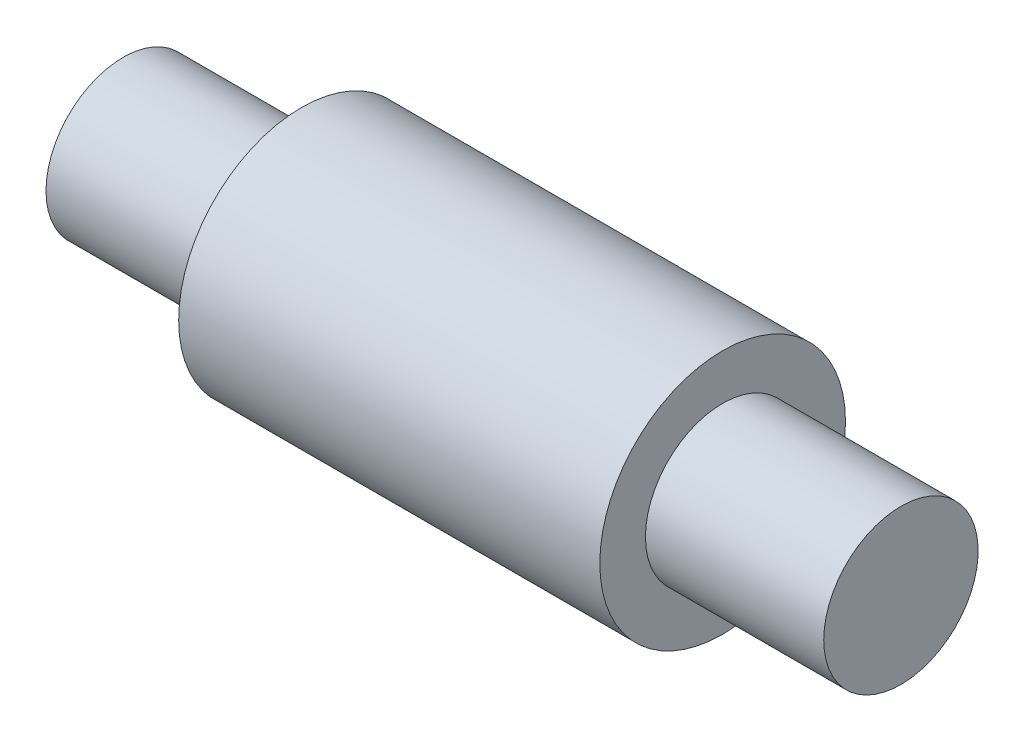
ISO-10303-21;
HEADER;
FILE_DESCRIPTION(('STEP AP214'),'2;1');
FILE_NAME('part.step','',(''),(''),'','','');
FILE_SCHEMA(('AUTOMOTIVE_DESIGN { 1 0 10303 214 1 1 1 1 }'));
ENDSEC;
DATA;
#1=APPLICATION_CONTEXT('core data for automotive mechanical design processes');
#2=APPLICATION_PROTOCOL_DEFINITION('international standard','automotive_design',2000,#1);
#3=PRODUCT_CONTEXT('',#1,'mechanical');
#4=PRODUCT('Part','Part','',(#3));
#5=PRODUCT_RELATED_PRODUCT_CATEGORY('part','',(#4));
#6=PRODUCT_DEFINITION_FORMATION('','',#4);
#7=PRODUCT_DEFINITION_CONTEXT('part definition',#1,'design');
#8=PRODUCT_DEFINITION('design','',#6,#7);
#9=PRODUCT_DEFINITION_SHAPE('','',#8);
#10=(LENGTH_UNIT() NAMED_UNIT(*) SI_UNIT(.MILLI.,.METRE.));
#11=(NAMED_UNIT(*) PLANE_ANGLE_UNIT() SI_UNIT($,.RADIAN.));
#12=(NAMED_UNIT(*) SI_UNIT($,.STERADIAN.) SOLID_ANGLE_UNIT());
#13=UNCERTAINTY_MEASURE_WITH_UNIT(LENGTH_MEASURE(1.E-05),#10,'distance_accuracy_value','');
#14=(GEOMETRIC_REPRESENTATION_CONTEXT(3) GLOBAL_UNCERTAINTY_ASSIGNED_CONTEXT((#13)) GLOBAL_UNIT_ASSIGNED_CONTEXT((#10,
#11,#12)) REPRESENTATION_CONTEXT('',''));
#15=CARTESIAN_POINT('',(0.,0.,0.));
#16=DIRECTION('',(0.,0.,1.));
#17=DIRECTION('',(1.,0.,0.));
#18=AXIS2_PLACEMENT_3D('',#15,#16,#17);
#19=CARTESIAN_POINT('',(12.7,0.,0.));
#20=DIRECTION('',(-1.,0.,0.));
#21=DIRECTION('',(0.,0.,1.));
#22=AXIS2_PLACEMENT_3D('',#19,#20,#21);
#23=PLANE('',#22);
#24=CARTESIAN_POINT('',(12.6999999999999,0.,0.));
#25=DIRECTION('',(-1.,0.,0.));
#26=DIRECTION('',(0.,0.,1.));
#27=AXIS2_PLACEMENT_3D('',#24,#25,#26);
#28=CIRCLE('',#27,5.5);
#29=CARTESIAN_POINT('',(12.6999999999999,0.,5.5));
#30=VERTEX_POINT('',#29);
#31=EDGE_CURVE('E10',#30,#30,#28,.T.);
#32=ORIENTED_EDGE('',*,*,#31,.F.);
#33=EDGE_LOOP('',(#32));
#34=FACE_BOUND('',#33,.T.);
#35=ADVANCED_FACE('F39',(#34),#23,.F.);
#36=CARTESIAN_POINT('',(-1000.,0.,0.));
#37=DIRECTION('',(-1.,0.,0.));
#38=DIRECTION('',(0.,0.,1.));
#39=AXIS2_PLACEMENT_3D('',#36,#37,#38);
#40=CYLINDRICAL_SURFACE('',#39,5.5);
#41=CARTESIAN_POINT('',(0.,0.,0.));
#42=DIRECTION('',(-1.,0.,0.));
#43=DIRECTION('',(0.,0.,1.));
#44=AXIS2_PLACEMENT_3D('',#41,#42,#43);
#45=CIRCLE('',#44,5.5);
#46=CARTESIAN_POINT('',(0.,0.,5.5));
#47=VERTEX_POINT('',#46);
#48=EDGE_CURVE('E44',#47,#47,#45,.T.);
#49=ORIENTED_EDGE('',*,*,#48,.F.);
#50=EDGE_LOOP('',(#49));
#51=FACE_BOUND('',#50,.T.);
#52=ORIENTED_EDGE('',*,*,#31,.T.);
#53=EDGE_LOOP('',(#52));
#54=FACE_BOUND('',#53,.T.);
#55=ADVANCED_FACE('F87',(#51,#54),#40,.T.);
#56=CARTESIAN_POINT('',(0.,5.5,0.));
#57=DIRECTION('',(-1.,0.,0.));
#58=DIRECTION('',(0.,0.,1.));
#59=AXIS2_PLACEMENT_3D('',#56,#57,#58);
#60=PLANE('',#59);
#61=CARTESIAN_POINT('',(0.,0.,0.));
#62=DIRECTION('',(-1.,0.,0.));
#63=DIRECTION('',(0.,0.,1.));
#64=AXIS2_PLACEMENT_3D('',#61,#62,#63);
#65=CIRCLE('',#64,8.75);
#66=CARTESIAN_POINT('',(0.,0.,8.75));
#67=VERTEX_POINT('',#66);
#68=EDGE_CURVE('E47',#67,#67,#65,.T.);
#69=ORIENTED_EDGE('',*,*,#68,.F.);
#70=EDGE_LOOP('',(#69));
#71=FACE_BOUND('',#70,.T.);
#72=ORIENTED_EDGE('',*,*,#48,.T.);
#73=EDGE_LOOP('',(#72));
#74=FACE_BOUND('',#73,.T.);
#75=ADVANCED_FACE('F82',(#71,#74),#60,.F.);
#76=CARTESIAN_POINT('',(-1000.,0.,0.));
#77=DIRECTION('',(-1.,0.,0.));
#78=DIRECTION('',(0.,0.,1.));
#79=AXIS2_PLACEMENT_3D('',#76,#77,#78);
#80=CYLINDRICAL_SURFACE('',#79,8.75);
#81=CARTESIAN_POINT('',(-30.,0.,0.));
#82=DIRECTION('',(-1.,0.,0.));
#83=DIRECTION('',(0.,0.,1.));
#84=AXIS2_PLACEMENT_3D('',#81,#82,#83);
#85=CIRCLE('',#84,8.75);
#86=CARTESIAN_POINT('',(-30.,0.,8.75));
#87=VERTEX_POINT('',#86);
#88=EDGE_CURVE('E52',#87,#87,#85,.T.);
#89=ORIENTED_EDGE('',*,*,#88,.F.);
#90=EDGE_LOOP('',(#89));
#91=FACE_BOUND('',#90,.T.);
#92=ORIENTED_EDGE('',*,*,#68,.T.);
#93=EDGE_LOOP('',(#92));
#94=FACE_BOUND('',#93,.T.);
#95=ADVANCED_FACE('F77',(#91,#94),#80,.T.);
#96=CARTESIAN_POINT('',(-30.,8.75,0.));
#97=DIRECTION('',(1.,0.,0.));
#98=DIRECTION('',(0.,0.,-1.));
#99=AXIS2_PLACEMENT_3D('',#96,#97,#98);
#100=PLANE('',#99);
#101=CARTESIAN_POINT('',(-30.,0.,0.));
#102=DIRECTION('',(-1.,0.,0.));
#103=DIRECTION('',(0.,0.,1.));
#104=AXIS2_PLACEMENT_3D('',#101,#102,#103);
#105=CIRCLE('',#104,5.5);
#106=CARTESIAN_POINT('',(-30.,0.,5.5));
#107=VERTEX_POINT('',#106);
#108=EDGE_CURVE('E59',#107,#107,#105,.T.);
#109=ORIENTED_EDGE('',*,*,#108,.F.);
#110=EDGE_LOOP('',(#109));
#111=FACE_BOUND('',#110,.T.);
#112=ORIENTED_EDGE('',*,*,#88,.T.);
#113=EDGE_LOOP('',(#112));
#114=FACE_BOUND('',#113,.T.);
#115=ADVANCED_FACE('F70',(#111,#114),#100,.F.);
#116=CARTESIAN_POINT('',(-1000.,0.,0.));
#117=DIRECTION('',(-1.,0.,0.));
#118=DIRECTION('',(0.,0.,1.));
#119=AXIS2_PLACEMENT_3D('',#116,#117,#118);
#120=CYLINDRICAL_SURFACE('',#119,5.5);
#121=CARTESIAN_POINT('',(-42.7,0.,0.));
#122=DIRECTION('',(-1.,0.,0.));
#123=DIRECTION('',(0.,0.,1.));
#124=AXIS2_PLACEMENT_3D('',#121,#122,#123);
#125=CIRCLE('',#124,5.5);
#126=CARTESIAN_POINT('',(-42.7,0.,5.5));
#127=VERTEX_POINT('',#126);
#128=EDGE_CURVE('E62',#127,#127,#125,.T.);
#129=ORIENTED_EDGE('',*,*,#128,.F.);
#130=EDGE_LOOP('',(#129));
#131=FACE_BOUND('',#130,.T.);
#132=ORIENTED_EDGE('',*,*,#108,.T.);
#133=EDGE_LOOP('',(#132));
#134=FACE_BOUND('',#133,.T.);
#135=ADVANCED_FACE('F67',(#131,#134),#120,.T.);
#136=CARTESIAN_POINT('',(-42.7,5.5,0.));
#137=DIRECTION('',(1.,0.,0.));
#138=DIRECTION('',(0.,0.,-1.));
#139=AXIS2_PLACEMENT_3D('',#136,#137,#138);
#140=PLANE('',#139);
#141=ORIENTED_EDGE('',*,*,#128,.T.);
#142=EDGE_LOOP('',(#141));
#143=FACE_BOUND('',#142,.T.);
#144=ADVANCED_FACE('F63',(#143),#140,.F.);
#145=CLOSED_SHELL('',(#35,#55,#75,#95,#115,#135,#144));
#146=MANIFOLD_SOLID_BREP('B2',#145);
#147=ADVANCED_BREP_SHAPE_REPRESENTATION('',(#18,#146),#14);
#148=SHAPE_DEFINITION_REPRESENTATION(#9,#147);
ENDSEC;
END-ISO-10303-21;
